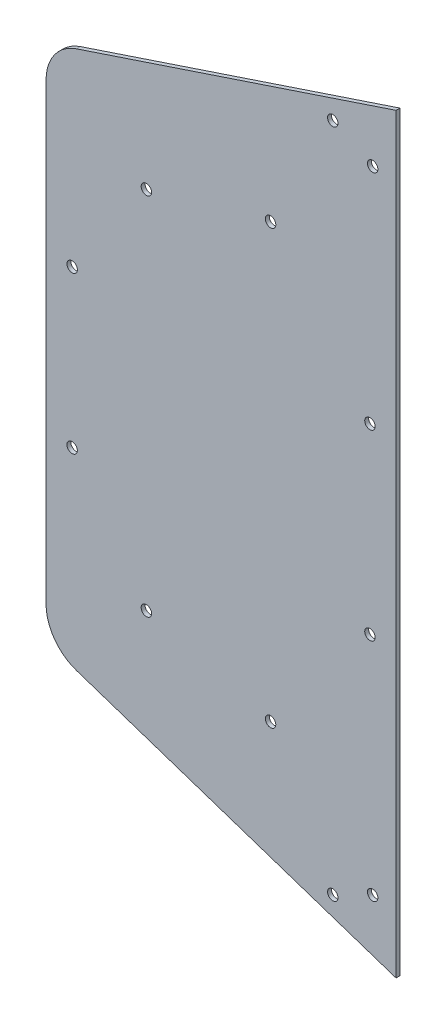
ISO-10303-21;
HEADER;
FILE_DESCRIPTION(('STEP AP214'),'2;1');
FILE_NAME('part.step','',(''),(''),'','','');
FILE_SCHEMA(('AUTOMOTIVE_DESIGN { 1 0 10303 214 1 1 1 1 }'));
ENDSEC;
DATA;
#1=APPLICATION_CONTEXT('core data for automotive mechanical design processes');
#2=APPLICATION_PROTOCOL_DEFINITION('international standard','automotive_design',2000,#1);
#3=PRODUCT_CONTEXT('',#1,'mechanical');
#4=PRODUCT('Part','Part','',(#3));
#5=PRODUCT_RELATED_PRODUCT_CATEGORY('part','',(#4));
#6=PRODUCT_DEFINITION_FORMATION('','',#4);
#7=PRODUCT_DEFINITION_CONTEXT('part definition',#1,'design');
#8=PRODUCT_DEFINITION('design','',#6,#7);
#9=PRODUCT_DEFINITION_SHAPE('','',#8);
#10=(LENGTH_UNIT() NAMED_UNIT(*) SI_UNIT(.MILLI.,.METRE.));
#11=(NAMED_UNIT(*) PLANE_ANGLE_UNIT() SI_UNIT($,.RADIAN.));
#12=(NAMED_UNIT(*) SI_UNIT($,.STERADIAN.) SOLID_ANGLE_UNIT());
#13=UNCERTAINTY_MEASURE_WITH_UNIT(LENGTH_MEASURE(1.E-05),#10,'distance_accuracy_value','');
#14=(GEOMETRIC_REPRESENTATION_CONTEXT(3) GLOBAL_UNCERTAINTY_ASSIGNED_CONTEXT((#13)) GLOBAL_UNIT_ASSIGNED_CONTEXT((#10,
#11,#12)) REPRESENTATION_CONTEXT('',''));
#15=CARTESIAN_POINT('',(0.,0.,0.));
#16=DIRECTION('',(0.,0.,1.));
#17=DIRECTION('',(1.,0.,0.));
#18=AXIS2_PLACEMENT_3D('',#15,#16,#17);
#19=CARTESIAN_POINT('',(-284.125,0.,3.));
#20=DIRECTION('',(1.,0.,0.));
#21=DIRECTION('',(0.,1.,0.));
#22=AXIS2_PLACEMENT_3D('',#19,#20,#21);
#23=PLANE('',#22);
#24=DIRECTION('',(0.,-1.,0.));
#25=VECTOR('',#24,1.);
#26=CARTESIAN_POINT('',(-284.125,0.,0.));
#27=LINE('',#26,#25);
#28=CARTESIAN_POINT('',(-284.125,173.962038997194,0.));
#29=VERTEX_POINT('',#28);
#30=CARTESIAN_POINT('',(-284.125,-173.962038997194,0.));
#31=VERTEX_POINT('',#30);
#32=EDGE_CURVE('E162',#29,#31,#27,.T.);
#33=ORIENTED_EDGE('',*,*,#32,.T.);
#34=DIRECTION('',(0.,0.,-1.));
#35=VECTOR('',#34,1.);
#36=CARTESIAN_POINT('',(-284.125,-173.962038997194,3.));
#37=LINE('',#36,#35);
#38=CARTESIAN_POINT('',(-284.125,-173.962038997194,3.));
#39=VERTEX_POINT('',#38);
#40=EDGE_CURVE('E11',#39,#31,#37,.T.);
#41=ORIENTED_EDGE('',*,*,#40,.F.);
#42=DIRECTION('',(0.,-1.,0.));
#43=VECTOR('',#42,1.);
#44=CARTESIAN_POINT('',(-284.125,0.,3.));
#45=LINE('',#44,#43);
#46=CARTESIAN_POINT('',(-284.125,173.962038997194,3.));
#47=VERTEX_POINT('',#46);
#48=EDGE_CURVE('E196',#47,#39,#45,.T.);
#49=ORIENTED_EDGE('',*,*,#48,.F.);
#50=DIRECTION('',(0.,0.,-1.));
#51=VECTOR('',#50,1.);
#52=CARTESIAN_POINT('',(-284.125,173.962038997194,3.));
#53=LINE('',#52,#51);
#54=EDGE_CURVE('E134',#47,#29,#53,.T.);
#55=ORIENTED_EDGE('',*,*,#54,.T.);
#56=EDGE_LOOP('',(#33,#41,#49,#55));
#57=FACE_BOUND('',#56,.T.);
#58=ADVANCED_FACE('F41',(#57),#23,.F.);
#59=CARTESIAN_POINT('',(-250.,-173.962038997194,3.));
#60=DIRECTION('',(0.,0.,-1.));
#61=DIRECTION('',(-1.,0.,0.));
#62=AXIS2_PLACEMENT_3D('',#59,#60,#61);
#63=CYLINDRICAL_SURFACE('',#62,34.125);
#64=CARTESIAN_POINT('',(-250.,-173.962038997194,0.));
#65=DIRECTION('',(0.,0.,1.));
#66=DIRECTION('',(1.,0.,0.));
#67=AXIS2_PLACEMENT_3D('',#64,#65,#66);
#68=CIRCLE('',#67,34.125);
#69=CARTESIAN_POINT('',(-260.791272515325,-206.335856543168,0.));
#70=VERTEX_POINT('',#69);
#71=EDGE_CURVE('E165',#31,#70,#68,.T.);
#72=ORIENTED_EDGE('',*,*,#71,.T.);
#73=DIRECTION('',(0.,0.,-1.));
#74=VECTOR('',#73,1.);
#75=CARTESIAN_POINT('',(-260.791272515325,-206.335856543168,3.));
#76=LINE('',#75,#74);
#77=CARTESIAN_POINT('',(-260.791272515325,-206.335856543168,3.));
#78=VERTEX_POINT('',#77);
#79=EDGE_CURVE('E50',#78,#70,#76,.T.);
#80=ORIENTED_EDGE('',*,*,#79,.F.);
#81=CARTESIAN_POINT('',(-250.,-173.962038997194,3.));
#82=DIRECTION('',(0.,0.,1.));
#83=DIRECTION('',(1.,0.,0.));
#84=AXIS2_PLACEMENT_3D('',#81,#82,#83);
#85=CIRCLE('',#84,34.125);
#86=EDGE_CURVE('E91',#39,#78,#85,.T.);
#87=ORIENTED_EDGE('',*,*,#86,.F.);
#88=ORIENTED_EDGE('',*,*,#40,.T.);
#89=EDGE_LOOP('',(#72,#80,#87,#88));
#90=FACE_BOUND('',#89,.T.);
#91=ADVANCED_FACE('F214',(#90),#63,.T.);
#92=CARTESIAN_POINT('',(-87.9798842144828,-263.939652643448,3.));
#93=DIRECTION('',(0.316227766016838,0.948683298050514,0.));
#94=DIRECTION('',(-0.948683298050514,0.316227766016838,0.));
#95=AXIS2_PLACEMENT_3D('',#92,#93,#94);
#96=PLANE('',#95);
#97=DIRECTION('',(0.948683298050514,-0.316227766016838,0.));
#98=VECTOR('',#97,1.);
#99=CARTESIAN_POINT('',(-87.9798842144828,-263.939652643448,0.));
#100=LINE('',#99,#98);
#101=CARTESIAN_POINT('',(-15.875,-287.974614048276,0.));
#102=VERTEX_POINT('',#101);
#103=EDGE_CURVE('E167',#70,#102,#100,.T.);
#104=ORIENTED_EDGE('',*,*,#103,.T.);
#105=DIRECTION('',(0.,0.,-1.));
#106=VECTOR('',#105,1.);
#107=CARTESIAN_POINT('',(-15.875,-287.974614048276,3.));
#108=LINE('',#107,#106);
#109=CARTESIAN_POINT('',(-15.875,-287.974614048276,3.));
#110=VERTEX_POINT('',#109);
#111=EDGE_CURVE('E118',#110,#102,#108,.T.);
#112=ORIENTED_EDGE('',*,*,#111,.F.);
#113=DIRECTION('',(0.948683298050514,-0.316227766016838,0.));
#114=VECTOR('',#113,1.);
#115=CARTESIAN_POINT('',(-87.9798842144828,-263.939652643448,3.));
#116=LINE('',#115,#114);
#117=EDGE_CURVE('E105',#78,#110,#116,.T.);
#118=ORIENTED_EDGE('',*,*,#117,.F.);
#119=ORIENTED_EDGE('',*,*,#79,.T.);
#120=EDGE_LOOP('',(#104,#112,#118,#119));
#121=FACE_BOUND('',#120,.T.);
#122=ADVANCED_FACE('F188',(#121),#96,.F.);
#123=CARTESIAN_POINT('',(-15.875,0.,3.));
#124=DIRECTION('',(-1.,0.,0.));
#125=DIRECTION('',(0.,0.,1.));
#126=AXIS2_PLACEMENT_3D('',#123,#124,#125);
#127=PLANE('',#126);
#128=DIRECTION('',(0.,1.,0.));
#129=VECTOR('',#128,1.);
#130=CARTESIAN_POINT('',(-15.875,0.,0.));
#131=LINE('',#130,#129);
#132=CARTESIAN_POINT('',(-15.875,287.974614048276,0.));
#133=VERTEX_POINT('',#132);
#134=EDGE_CURVE('E114',#102,#133,#131,.T.);
#135=ORIENTED_EDGE('',*,*,#134,.T.);
#136=DIRECTION('',(0.,0.,-1.));
#137=VECTOR('',#136,1.);
#138=CARTESIAN_POINT('',(-15.875,287.974614048276,3.));
#139=LINE('',#138,#137);
#140=CARTESIAN_POINT('',(-15.875,287.974614048276,3.));
#141=VERTEX_POINT('',#140);
#142=EDGE_CURVE('E111',#141,#133,#139,.T.);
#143=ORIENTED_EDGE('',*,*,#142,.F.);
#144=DIRECTION('',(0.,1.,0.));
#145=VECTOR('',#144,1.);
#146=CARTESIAN_POINT('',(-15.875,0.,3.));
#147=LINE('',#146,#145);
#148=EDGE_CURVE('E98',#110,#141,#147,.T.);
#149=ORIENTED_EDGE('',*,*,#148,.F.);
#150=ORIENTED_EDGE('',*,*,#111,.T.);
#151=EDGE_LOOP('',(#135,#143,#149,#150));
#152=FACE_BOUND('',#151,.T.);
#153=ADVANCED_FACE('F112',(#152),#127,.F.);
#154=CARTESIAN_POINT('',(-87.9798842144827,263.939652643448,3.));
#155=DIRECTION('',(-0.316227766016838,0.948683298050514,0.));
#156=DIRECTION('',(-0.948683298050514,-0.316227766016838,0.));
#157=AXIS2_PLACEMENT_3D('',#154,#155,#156);
#158=PLANE('',#157);
#159=DIRECTION('',(0.948683298050514,0.316227766016838,0.));
#160=VECTOR('',#159,1.);
#161=CARTESIAN_POINT('',(-87.9798842144827,263.939652643448,0.));
#162=LINE('',#161,#160);
#163=CARTESIAN_POINT('',(-260.791272515325,206.335856543167,0.));
#164=VERTEX_POINT('',#163);
#165=EDGE_CURVE('E170',#164,#133,#162,.T.);
#166=ORIENTED_EDGE('',*,*,#165,.F.);
#167=DIRECTION('',(0.,0.,-1.));
#168=VECTOR('',#167,1.);
#169=CARTESIAN_POINT('',(-260.791272515325,206.335856543167,3.));
#170=LINE('',#169,#168);
#171=CARTESIAN_POINT('',(-260.791272515325,206.335856543167,3.));
#172=VERTEX_POINT('',#171);
#173=EDGE_CURVE('E80',#172,#164,#170,.T.);
#174=ORIENTED_EDGE('',*,*,#173,.F.);
#175=DIRECTION('',(0.948683298050514,0.316227766016838,0.));
#176=VECTOR('',#175,1.);
#177=CARTESIAN_POINT('',(-87.9798842144827,263.939652643448,3.));
#178=LINE('',#177,#176);
#179=EDGE_CURVE('E103',#172,#141,#178,.T.);
#180=ORIENTED_EDGE('',*,*,#179,.T.);
#181=ORIENTED_EDGE('',*,*,#142,.T.);
#182=EDGE_LOOP('',(#166,#174,#180,#181));
#183=FACE_BOUND('',#182,.T.);
#184=ADVANCED_FACE('F120',(#183),#158,.T.);
#185=CARTESIAN_POINT('',(-264.125,60.,3.));
#186=DIRECTION('',(0.,0.,-1.));
#187=DIRECTION('',(-1.,0.,0.));
#188=AXIS2_PLACEMENT_3D('',#185,#186,#187);
#189=CYLINDRICAL_SURFACE('',#188,4.00000000000001);
#190=CARTESIAN_POINT('',(-264.125,60.,3.));
#191=DIRECTION('',(0.,0.,1.));
#192=DIRECTION('',(1.,0.,0.));
#193=AXIS2_PLACEMENT_3D('',#190,#191,#192);
#194=CIRCLE('',#193,4.00000000000001);
#195=CARTESIAN_POINT('',(-260.125,60.,3.));
#196=VERTEX_POINT('',#195);
#197=EDGE_CURVE('E128',#196,#196,#194,.F.);
#198=ORIENTED_EDGE('',*,*,#197,.F.);
#199=EDGE_LOOP('',(#198));
#200=FACE_BOUND('',#199,.T.);
#201=CARTESIAN_POINT('',(-264.125,60.,0.));
#202=DIRECTION('',(0.,0.,1.));
#203=DIRECTION('',(1.,0.,0.));
#204=AXIS2_PLACEMENT_3D('',#201,#202,#203);
#205=CIRCLE('',#204,4.00000000000001);
#206=CARTESIAN_POINT('',(-260.125,60.,0.));
#207=VERTEX_POINT('',#206);
#208=EDGE_CURVE('E176',#207,#207,#205,.F.);
#209=ORIENTED_EDGE('',*,*,#208,.T.);
#210=EDGE_LOOP('',(#209));
#211=FACE_BOUND('',#210,.T.);
#212=ADVANCED_FACE('F209',(#200,#211),#189,.F.);
#213=CARTESIAN_POINT('',(-112.045275133741,165.911573343797,3.));
#214=DIRECTION('',(0.,0.,-1.));
#215=DIRECTION('',(-1.,0.,0.));
#216=AXIS2_PLACEMENT_3D('',#213,#214,#215);
#217=CYLINDRICAL_SURFACE('',#216,3.99999999999999);
#218=CARTESIAN_POINT('',(-112.045275133741,165.911573343797,3.));
#219=DIRECTION('',(0.,0.,1.));
#220=DIRECTION('',(1.,0.,0.));
#221=AXIS2_PLACEMENT_3D('',#218,#219,#220);
#222=CIRCLE('',#221,3.99999999999999);
#223=CARTESIAN_POINT('',(-108.045275133741,165.911573343797,3.));
#224=VERTEX_POINT('',#223);
#225=EDGE_CURVE('E122',#224,#224,#222,.F.);
#226=ORIENTED_EDGE('',*,*,#225,.F.);
#227=EDGE_LOOP('',(#226));
#228=FACE_BOUND('',#227,.T.);
#229=CARTESIAN_POINT('',(-112.045275133741,165.911573343797,0.));
#230=DIRECTION('',(0.,0.,1.));
#231=DIRECTION('',(1.,0.,0.));
#232=AXIS2_PLACEMENT_3D('',#229,#230,#231);
#233=CIRCLE('',#232,3.99999999999999);
#234=CARTESIAN_POINT('',(-108.045275133741,165.911573343797,0.));
#235=VERTEX_POINT('',#234);
#236=EDGE_CURVE('E173',#235,#235,#233,.F.);
#237=ORIENTED_EDGE('',*,*,#236,.T.);
#238=EDGE_LOOP('',(#237));
#239=FACE_BOUND('',#238,.T.);
#240=ADVANCED_FACE('F200',(#228,#239),#217,.F.);
#241=CARTESIAN_POINT('',(-250.,173.962038997194,3.));
#242=DIRECTION('',(0.,0.,-1.));
#243=DIRECTION('',(-1.,0.,0.));
#244=AXIS2_PLACEMENT_3D('',#241,#242,#243);
#245=CYLINDRICAL_SURFACE('',#244,34.125);
#246=CARTESIAN_POINT('',(-250.,173.962038997194,0.));
#247=DIRECTION('',(0.,0.,1.));
#248=DIRECTION('',(1.,0.,0.));
#249=AXIS2_PLACEMENT_3D('',#246,#247,#248);
#250=CIRCLE('',#249,34.125);
#251=EDGE_CURVE('E83',#164,#29,#250,.T.);
#252=ORIENTED_EDGE('',*,*,#251,.T.);
#253=ORIENTED_EDGE('',*,*,#54,.F.);
#254=CARTESIAN_POINT('',(-250.,173.962038997194,3.));
#255=DIRECTION('',(0.,0.,1.));
#256=DIRECTION('',(1.,0.,0.));
#257=AXIS2_PLACEMENT_3D('',#254,#255,#256);
#258=CIRCLE('',#257,34.125);
#259=EDGE_CURVE('E58',#172,#47,#258,.T.);
#260=ORIENTED_EDGE('',*,*,#259,.F.);
#261=ORIENTED_EDGE('',*,*,#173,.T.);
#262=EDGE_LOOP('',(#252,#253,#260,#261));
#263=FACE_BOUND('',#262,.T.);
#264=ADVANCED_FACE('F197',(#263),#245,.T.);
#265=CARTESIAN_POINT('',(-264.125,-60.,3.));
#266=DIRECTION('',(0.,0.,-1.));
#267=DIRECTION('',(-1.,0.,0.));
#268=AXIS2_PLACEMENT_3D('',#265,#266,#267);
#269=CYLINDRICAL_SURFACE('',#268,4.00000000000001);
#270=CARTESIAN_POINT('',(-264.125,-60.,3.));
#271=DIRECTION('',(0.,0.,1.));
#272=DIRECTION('',(1.,0.,0.));
#273=AXIS2_PLACEMENT_3D('',#270,#271,#272);
#274=CIRCLE('',#273,4.00000000000001);
#275=CARTESIAN_POINT('',(-260.125,-60.,3.));
#276=VERTEX_POINT('',#275);
#277=EDGE_CURVE('E457',#276,#276,#274,.T.);
#278=ORIENTED_EDGE('',*,*,#277,.T.);
#279=EDGE_LOOP('',(#278));
#280=FACE_BOUND('',#279,.T.);
#281=CARTESIAN_POINT('',(-264.125,-60.,0.));
#282=DIRECTION('',(0.,0.,1.));
#283=DIRECTION('',(1.,0.,0.));
#284=AXIS2_PLACEMENT_3D('',#281,#282,#283);
#285=CIRCLE('',#284,4.00000000000001);
#286=CARTESIAN_POINT('',(-260.125,-60.,0.));
#287=VERTEX_POINT('',#286);
#288=EDGE_CURVE('E159',#287,#287,#285,.T.);
#289=ORIENTED_EDGE('',*,*,#288,.F.);
#290=EDGE_LOOP('',(#289));
#291=FACE_BOUND('',#290,.T.);
#292=ADVANCED_FACE('F199',(#280,#291),#269,.F.);
#293=CARTESIAN_POINT('',(-207.217631200376,-139.799210517558,3.));
#294=DIRECTION('',(0.,0.,-1.));
#295=DIRECTION('',(-1.,0.,0.));
#296=AXIS2_PLACEMENT_3D('',#293,#294,#295);
#297=CYLINDRICAL_SURFACE('',#296,3.99999999999999);
#298=CARTESIAN_POINT('',(-207.217631200376,-139.799210517558,3.));
#299=DIRECTION('',(0.,0.,1.));
#300=DIRECTION('',(1.,0.,0.));
#301=AXIS2_PLACEMENT_3D('',#298,#299,#300);
#302=CIRCLE('',#301,3.99999999999999);
#303=CARTESIAN_POINT('',(-203.217631200376,-139.799210517558,3.));
#304=VERTEX_POINT('',#303);
#305=EDGE_CURVE('E454',#304,#304,#302,.T.);
#306=ORIENTED_EDGE('',*,*,#305,.T.);
#307=EDGE_LOOP('',(#306));
#308=FACE_BOUND('',#307,.T.);
#309=CARTESIAN_POINT('',(-207.217631200376,-139.799210517558,0.));
#310=DIRECTION('',(0.,0.,1.));
#311=DIRECTION('',(1.,0.,0.));
#312=AXIS2_PLACEMENT_3D('',#309,#310,#311);
#313=CIRCLE('',#312,3.99999999999999);
#314=CARTESIAN_POINT('',(-203.217631200376,-139.799210517558,0.));
#315=VERTEX_POINT('',#314);
#316=EDGE_CURVE('E156',#315,#315,#313,.T.);
#317=ORIENTED_EDGE('',*,*,#316,.F.);
#318=EDGE_LOOP('',(#317));
#319=FACE_BOUND('',#318,.T.);
#320=ADVANCED_FACE('F206',(#308,#319),#297,.F.);
#321=CARTESIAN_POINT('',(-112.045275133741,-165.911573343797,3.));
#322=DIRECTION('',(0.,0.,-1.));
#323=DIRECTION('',(-1.,0.,0.));
#324=AXIS2_PLACEMENT_3D('',#321,#322,#323);
#325=CYLINDRICAL_SURFACE('',#324,3.99999999999999);
#326=CARTESIAN_POINT('',(-112.045275133741,-165.911573343797,3.));
#327=DIRECTION('',(0.,0.,1.));
#328=DIRECTION('',(1.,0.,0.));
#329=AXIS2_PLACEMENT_3D('',#326,#327,#328);
#330=CIRCLE('',#329,3.99999999999999);
#331=CARTESIAN_POINT('',(-108.045275133741,-165.911573343797,3.));
#332=VERTEX_POINT('',#331);
#333=EDGE_CURVE('E450',#332,#332,#330,.T.);
#334=ORIENTED_EDGE('',*,*,#333,.T.);
#335=EDGE_LOOP('',(#334));
#336=FACE_BOUND('',#335,.T.);
#337=CARTESIAN_POINT('',(-112.045275133741,-165.911573343797,0.));
#338=DIRECTION('',(0.,0.,1.));
#339=DIRECTION('',(1.,0.,0.));
#340=AXIS2_PLACEMENT_3D('',#337,#338,#339);
#341=CIRCLE('',#340,3.99999999999999);
#342=CARTESIAN_POINT('',(-108.045275133741,-165.911573343797,0.));
#343=VERTEX_POINT('',#342);
#344=EDGE_CURVE('E153',#343,#343,#341,.T.);
#345=ORIENTED_EDGE('',*,*,#344,.F.);
#346=EDGE_LOOP('',(#345));
#347=FACE_BOUND('',#346,.T.);
#348=ADVANCED_FACE('F224',(#336,#347),#325,.F.);
#349=CARTESIAN_POINT('',(-35.875,-70.,3.));
#350=DIRECTION('',(0.,0.,-1.));
#351=DIRECTION('',(-1.,0.,0.));
#352=AXIS2_PLACEMENT_3D('',#349,#350,#351);
#353=CYLINDRICAL_SURFACE('',#352,4.00000000000001);
#354=CARTESIAN_POINT('',(-35.875,-70.,3.));
#355=DIRECTION('',(0.,0.,1.));
#356=DIRECTION('',(1.,0.,0.));
#357=AXIS2_PLACEMENT_3D('',#354,#355,#356);
#358=CIRCLE('',#357,4.00000000000001);
#359=CARTESIAN_POINT('',(-31.875,-70.,3.));
#360=VERTEX_POINT('',#359);
#361=EDGE_CURVE('E446',#360,#360,#358,.T.);
#362=ORIENTED_EDGE('',*,*,#361,.T.);
#363=EDGE_LOOP('',(#362));
#364=FACE_BOUND('',#363,.T.);
#365=CARTESIAN_POINT('',(-35.875,-70.,0.));
#366=DIRECTION('',(0.,0.,1.));
#367=DIRECTION('',(1.,0.,0.));
#368=AXIS2_PLACEMENT_3D('',#365,#366,#367);
#369=CIRCLE('',#368,4.00000000000001);
#370=CARTESIAN_POINT('',(-31.875,-70.,0.));
#371=VERTEX_POINT('',#370);
#372=EDGE_CURVE('E150',#371,#371,#369,.T.);
#373=ORIENTED_EDGE('',*,*,#372,.F.);
#374=EDGE_LOOP('',(#373));
#375=FACE_BOUND('',#374,.T.);
#376=ADVANCED_FACE('F228',(#364,#375),#353,.F.);
#377=CARTESIAN_POINT('',(-35.875,70.,3.));
#378=DIRECTION('',(0.,0.,-1.));
#379=DIRECTION('',(-1.,0.,0.));
#380=AXIS2_PLACEMENT_3D('',#377,#378,#379);
#381=CYLINDRICAL_SURFACE('',#380,4.00000000000001);
#382=CARTESIAN_POINT('',(-35.875,70.,3.));
#383=DIRECTION('',(0.,0.,1.));
#384=DIRECTION('',(1.,0.,0.));
#385=AXIS2_PLACEMENT_3D('',#382,#383,#384);
#386=CIRCLE('',#385,4.00000000000001);
#387=CARTESIAN_POINT('',(-31.875,70.,3.));
#388=VERTEX_POINT('',#387);
#389=EDGE_CURVE('E442',#388,#388,#386,.F.);
#390=ORIENTED_EDGE('',*,*,#389,.F.);
#391=EDGE_LOOP('',(#390));
#392=FACE_BOUND('',#391,.T.);
#393=CARTESIAN_POINT('',(-35.875,70.,0.));
#394=DIRECTION('',(0.,0.,1.));
#395=DIRECTION('',(1.,0.,0.));
#396=AXIS2_PLACEMENT_3D('',#393,#394,#395);
#397=CIRCLE('',#396,4.00000000000001);
#398=CARTESIAN_POINT('',(-31.875,70.,0.));
#399=VERTEX_POINT('',#398);
#400=EDGE_CURVE('E147',#399,#399,#397,.F.);
#401=ORIENTED_EDGE('',*,*,#400,.T.);
#402=EDGE_LOOP('',(#401));
#403=FACE_BOUND('',#402,.T.);
#404=ADVANCED_FACE('F232',(#392,#403),#381,.F.);
#405=CARTESIAN_POINT('',(-207.217631200376,139.799210517558,3.));
#406=DIRECTION('',(0.,0.,-1.));
#407=DIRECTION('',(-1.,0.,0.));
#408=AXIS2_PLACEMENT_3D('',#405,#406,#407);
#409=CYLINDRICAL_SURFACE('',#408,3.99999999999999);
#410=CARTESIAN_POINT('',(-207.217631200376,139.799210517558,3.));
#411=DIRECTION('',(0.,0.,1.));
#412=DIRECTION('',(1.,0.,0.));
#413=AXIS2_PLACEMENT_3D('',#410,#411,#412);
#414=CIRCLE('',#413,3.99999999999999);
#415=CARTESIAN_POINT('',(-203.217631200376,139.799210517558,3.));
#416=VERTEX_POINT('',#415);
#417=EDGE_CURVE('E438',#416,#416,#414,.F.);
#418=ORIENTED_EDGE('',*,*,#417,.F.);
#419=EDGE_LOOP('',(#418));
#420=FACE_BOUND('',#419,.T.);
#421=CARTESIAN_POINT('',(-207.217631200376,139.799210517558,0.));
#422=DIRECTION('',(0.,0.,1.));
#423=DIRECTION('',(1.,0.,0.));
#424=AXIS2_PLACEMENT_3D('',#421,#422,#423);
#425=CIRCLE('',#424,3.99999999999999);
#426=CARTESIAN_POINT('',(-203.217631200376,139.799210517558,0.));
#427=VERTEX_POINT('',#426);
#428=EDGE_CURVE('E144',#427,#427,#425,.F.);
#429=ORIENTED_EDGE('',*,*,#428,.T.);
#430=EDGE_LOOP('',(#429));
#431=FACE_BOUND('',#430,.T.);
#432=ADVANCED_FACE('F236',(#420,#431),#409,.F.);
#433=CARTESIAN_POINT('',(-64.3577430979992,-256.967862763879,3.));
#434=DIRECTION('',(0.,0.,-1.));
#435=DIRECTION('',(-1.,0.,0.));
#436=AXIS2_PLACEMENT_3D('',#433,#434,#435);
#437=CYLINDRICAL_SURFACE('',#436,3.99999999999999);
#438=CARTESIAN_POINT('',(-64.3577430979992,-256.967862763879,3.));
#439=DIRECTION('',(0.,0.,1.));
#440=DIRECTION('',(1.,0.,0.));
#441=AXIS2_PLACEMENT_3D('',#438,#439,#440);
#442=CIRCLE('',#441,3.99999999999999);
#443=CARTESIAN_POINT('',(-60.3577430979992,-256.967862763879,3.));
#444=VERTEX_POINT('',#443);
#445=EDGE_CURVE('E434',#444,#444,#442,.T.);
#446=ORIENTED_EDGE('',*,*,#445,.T.);
#447=EDGE_LOOP('',(#446));
#448=FACE_BOUND('',#447,.T.);
#449=CARTESIAN_POINT('',(-64.3577430979992,-256.967862763879,0.));
#450=DIRECTION('',(0.,0.,1.));
#451=DIRECTION('',(1.,0.,0.));
#452=AXIS2_PLACEMENT_3D('',#449,#450,#451);
#453=CIRCLE('',#452,3.99999999999999);
#454=CARTESIAN_POINT('',(-60.3577430979992,-256.967862763879,0.));
#455=VERTEX_POINT('',#454);
#456=EDGE_CURVE('E141',#455,#455,#453,.T.);
#457=ORIENTED_EDGE('',*,*,#456,.F.);
#458=EDGE_LOOP('',(#457));
#459=FACE_BOUND('',#458,.T.);
#460=ADVANCED_FACE('F240',(#448,#459),#437,.F.);
#461=CARTESIAN_POINT('',(-33.8000877655368,-241.845421711493,3.));
#462=DIRECTION('',(0.,0.,-1.));
#463=DIRECTION('',(-1.,0.,0.));
#464=AXIS2_PLACEMENT_3D('',#461,#462,#463);
#465=CYLINDRICAL_SURFACE('',#464,3.99999999999999);
#466=CARTESIAN_POINT('',(-33.8000877655368,-241.845421711493,3.));
#467=DIRECTION('',(0.,0.,1.));
#468=DIRECTION('',(1.,0.,0.));
#469=AXIS2_PLACEMENT_3D('',#466,#467,#468);
#470=CIRCLE('',#469,3.99999999999999);
#471=CARTESIAN_POINT('',(-29.8000877655368,-241.845421711493,3.));
#472=VERTEX_POINT('',#471);
#473=EDGE_CURVE('E255',#472,#472,#470,.T.);
#474=ORIENTED_EDGE('',*,*,#473,.T.);
#475=EDGE_LOOP('',(#474));
#476=FACE_BOUND('',#475,.T.);
#477=CARTESIAN_POINT('',(-33.8000877655368,-241.845421711493,0.));
#478=DIRECTION('',(0.,0.,1.));
#479=DIRECTION('',(1.,0.,0.));
#480=AXIS2_PLACEMENT_3D('',#477,#478,#479);
#481=CIRCLE('',#480,3.99999999999999);
#482=CARTESIAN_POINT('',(-29.8000877655368,-241.845421711493,0.));
#483=VERTEX_POINT('',#482);
#484=EDGE_CURVE('E138',#483,#483,#481,.T.);
#485=ORIENTED_EDGE('',*,*,#484,.F.);
#486=EDGE_LOOP('',(#485));
#487=FACE_BOUND('',#486,.T.);
#488=ADVANCED_FACE('F243',(#476,#487),#465,.F.);
#489=CARTESIAN_POINT('',(-33.8000877655368,241.845421711493,3.));
#490=DIRECTION('',(0.,0.,-1.));
#491=DIRECTION('',(-1.,0.,0.));
#492=AXIS2_PLACEMENT_3D('',#489,#490,#491);
#493=CYLINDRICAL_SURFACE('',#492,3.99999999999999);
#494=CARTESIAN_POINT('',(-33.8000877655368,241.845421711493,3.));
#495=DIRECTION('',(0.,0.,1.));
#496=DIRECTION('',(1.,0.,0.));
#497=AXIS2_PLACEMENT_3D('',#494,#495,#496);
#498=CIRCLE('',#497,3.99999999999999);
#499=CARTESIAN_POINT('',(-29.8000877655368,241.845421711493,3.));
#500=VERTEX_POINT('',#499);
#501=EDGE_CURVE('E182',#500,#500,#498,.F.);
#502=ORIENTED_EDGE('',*,*,#501,.F.);
#503=EDGE_LOOP('',(#502));
#504=FACE_BOUND('',#503,.T.);
#505=CARTESIAN_POINT('',(-33.8000877655368,241.845421711493,0.));
#506=DIRECTION('',(0.,0.,1.));
#507=DIRECTION('',(1.,0.,0.));
#508=AXIS2_PLACEMENT_3D('',#505,#506,#507);
#509=CIRCLE('',#508,3.99999999999999);
#510=CARTESIAN_POINT('',(-29.8000877655368,241.845421711493,0.));
#511=VERTEX_POINT('',#510);
#512=EDGE_CURVE('E135',#511,#511,#509,.F.);
#513=ORIENTED_EDGE('',*,*,#512,.T.);
#514=EDGE_LOOP('',(#513));
#515=FACE_BOUND('',#514,.T.);
#516=ADVANCED_FACE('F43',(#504,#515),#493,.F.);
#517=CARTESIAN_POINT('',(-64.3577430979992,256.967862763879,3.));
#518=DIRECTION('',(0.,0.,-1.));
#519=DIRECTION('',(-1.,0.,0.));
#520=AXIS2_PLACEMENT_3D('',#517,#518,#519);
#521=CYLINDRICAL_SURFACE('',#520,3.99999999999999);
#522=CARTESIAN_POINT('',(-64.3577430979992,256.967862763879,3.));
#523=DIRECTION('',(0.,0.,1.));
#524=DIRECTION('',(1.,0.,0.));
#525=AXIS2_PLACEMENT_3D('',#522,#523,#524);
#526=CIRCLE('',#525,3.99999999999999);
#527=CARTESIAN_POINT('',(-60.3577430979992,256.967862763879,3.));
#528=VERTEX_POINT('',#527);
#529=EDGE_CURVE('E131',#528,#528,#526,.F.);
#530=ORIENTED_EDGE('',*,*,#529,.F.);
#531=EDGE_LOOP('',(#530));
#532=FACE_BOUND('',#531,.T.);
#533=CARTESIAN_POINT('',(-64.3577430979992,256.967862763879,0.));
#534=DIRECTION('',(0.,0.,1.));
#535=DIRECTION('',(1.,0.,0.));
#536=AXIS2_PLACEMENT_3D('',#533,#534,#535);
#537=CIRCLE('',#536,3.99999999999999);
#538=CARTESIAN_POINT('',(-60.3577430979992,256.967862763879,0.));
#539=VERTEX_POINT('',#538);
#540=EDGE_CURVE('E179',#539,#539,#537,.F.);
#541=ORIENTED_EDGE('',*,*,#540,.T.);
#542=EDGE_LOOP('',(#541));
#543=FACE_BOUND('',#542,.T.);
#544=ADVANCED_FACE('F250',(#532,#543),#521,.F.);
#545=CARTESIAN_POINT('',(0.,0.,3.));
#546=DIRECTION('',(0.,0.,1.));
#547=DIRECTION('',(1.,0.,0.));
#548=AXIS2_PLACEMENT_3D('',#545,#546,#547);
#549=PLANE('',#548);
#550=ORIENTED_EDGE('',*,*,#501,.T.);
#551=EDGE_LOOP('',(#550));
#552=FACE_BOUND('',#551,.T.);
#553=ORIENTED_EDGE('',*,*,#473,.F.);
#554=EDGE_LOOP('',(#553));
#555=FACE_BOUND('',#554,.T.);
#556=ORIENTED_EDGE('',*,*,#445,.F.);
#557=EDGE_LOOP('',(#556));
#558=FACE_BOUND('',#557,.T.);
#559=ORIENTED_EDGE('',*,*,#417,.T.);
#560=EDGE_LOOP('',(#559));
#561=FACE_BOUND('',#560,.T.);
#562=ORIENTED_EDGE('',*,*,#389,.T.);
#563=EDGE_LOOP('',(#562));
#564=FACE_BOUND('',#563,.T.);
#565=ORIENTED_EDGE('',*,*,#361,.F.);
#566=EDGE_LOOP('',(#565));
#567=FACE_BOUND('',#566,.T.);
#568=ORIENTED_EDGE('',*,*,#333,.F.);
#569=EDGE_LOOP('',(#568));
#570=FACE_BOUND('',#569,.T.);
#571=ORIENTED_EDGE('',*,*,#305,.F.);
#572=EDGE_LOOP('',(#571));
#573=FACE_BOUND('',#572,.T.);
#574=ORIENTED_EDGE('',*,*,#277,.F.);
#575=EDGE_LOOP('',(#574));
#576=FACE_BOUND('',#575,.T.);
#577=ORIENTED_EDGE('',*,*,#48,.T.);
#578=ORIENTED_EDGE('',*,*,#86,.T.);
#579=ORIENTED_EDGE('',*,*,#117,.T.);
#580=ORIENTED_EDGE('',*,*,#148,.T.);
#581=ORIENTED_EDGE('',*,*,#179,.F.);
#582=ORIENTED_EDGE('',*,*,#259,.T.);
#583=EDGE_LOOP('',(#577,#578,#579,#580,#581,#582));
#584=FACE_BOUND('',#583,.T.);
#585=ORIENTED_EDGE('',*,*,#225,.T.);
#586=EDGE_LOOP('',(#585));
#587=FACE_BOUND('',#586,.T.);
#588=ORIENTED_EDGE('',*,*,#197,.T.);
#589=EDGE_LOOP('',(#588));
#590=FACE_BOUND('',#589,.T.);
#591=ORIENTED_EDGE('',*,*,#529,.T.);
#592=EDGE_LOOP('',(#591));
#593=FACE_BOUND('',#592,.T.);
#594=ADVANCED_FACE('F100',(#552,#555,#558,#561,#564,#567,#570,#573,#576,#584,#587,#590,#593),
#549,.T.);
#595=CARTESIAN_POINT('',(0.,0.,0.));
#596=DIRECTION('',(0.,0.,1.));
#597=DIRECTION('',(1.,0.,0.));
#598=AXIS2_PLACEMENT_3D('',#595,#596,#597);
#599=PLANE('',#598);
#600=ORIENTED_EDGE('',*,*,#512,.F.);
#601=EDGE_LOOP('',(#600));
#602=FACE_BOUND('',#601,.T.);
#603=ORIENTED_EDGE('',*,*,#484,.T.);
#604=EDGE_LOOP('',(#603));
#605=FACE_BOUND('',#604,.T.);
#606=ORIENTED_EDGE('',*,*,#456,.T.);
#607=EDGE_LOOP('',(#606));
#608=FACE_BOUND('',#607,.T.);
#609=ORIENTED_EDGE('',*,*,#428,.F.);
#610=EDGE_LOOP('',(#609));
#611=FACE_BOUND('',#610,.T.);
#612=ORIENTED_EDGE('',*,*,#400,.F.);
#613=EDGE_LOOP('',(#612));
#614=FACE_BOUND('',#613,.T.);
#615=ORIENTED_EDGE('',*,*,#372,.T.);
#616=EDGE_LOOP('',(#615));
#617=FACE_BOUND('',#616,.T.);
#618=ORIENTED_EDGE('',*,*,#344,.T.);
#619=EDGE_LOOP('',(#618));
#620=FACE_BOUND('',#619,.T.);
#621=ORIENTED_EDGE('',*,*,#316,.T.);
#622=EDGE_LOOP('',(#621));
#623=FACE_BOUND('',#622,.T.);
#624=ORIENTED_EDGE('',*,*,#288,.T.);
#625=EDGE_LOOP('',(#624));
#626=FACE_BOUND('',#625,.T.);
#627=ORIENTED_EDGE('',*,*,#32,.F.);
#628=ORIENTED_EDGE('',*,*,#251,.F.);
#629=ORIENTED_EDGE('',*,*,#165,.T.);
#630=ORIENTED_EDGE('',*,*,#134,.F.);
#631=ORIENTED_EDGE('',*,*,#103,.F.);
#632=ORIENTED_EDGE('',*,*,#71,.F.);
#633=EDGE_LOOP('',(#627,#628,#629,#630,#631,#632));
#634=FACE_BOUND('',#633,.T.);
#635=ORIENTED_EDGE('',*,*,#236,.F.);
#636=EDGE_LOOP('',(#635));
#637=FACE_BOUND('',#636,.T.);
#638=ORIENTED_EDGE('',*,*,#208,.F.);
#639=EDGE_LOOP('',(#638));
#640=FACE_BOUND('',#639,.T.);
#641=ORIENTED_EDGE('',*,*,#540,.F.);
#642=EDGE_LOOP('',(#641));
#643=FACE_BOUND('',#642,.T.);
#644=ADVANCED_FACE('F191',(#602,#605,#608,#611,#614,#617,#620,#623,#626,#634,#637,#640,#643),
#599,.F.);
#645=CLOSED_SHELL('',(#58,#91,#122,#153,#184,#212,#240,#264,#292,#320,#348,#376,#404,#432,#460,
#488,#516,#544,#594,#644));
#646=MANIFOLD_SOLID_BREP('B2',#645);
#647=ADVANCED_BREP_SHAPE_REPRESENTATION('',(#18,#646),#14);
#648=SHAPE_DEFINITION_REPRESENTATION(#9,#647);
ENDSEC;
END-ISO-10303-21;
